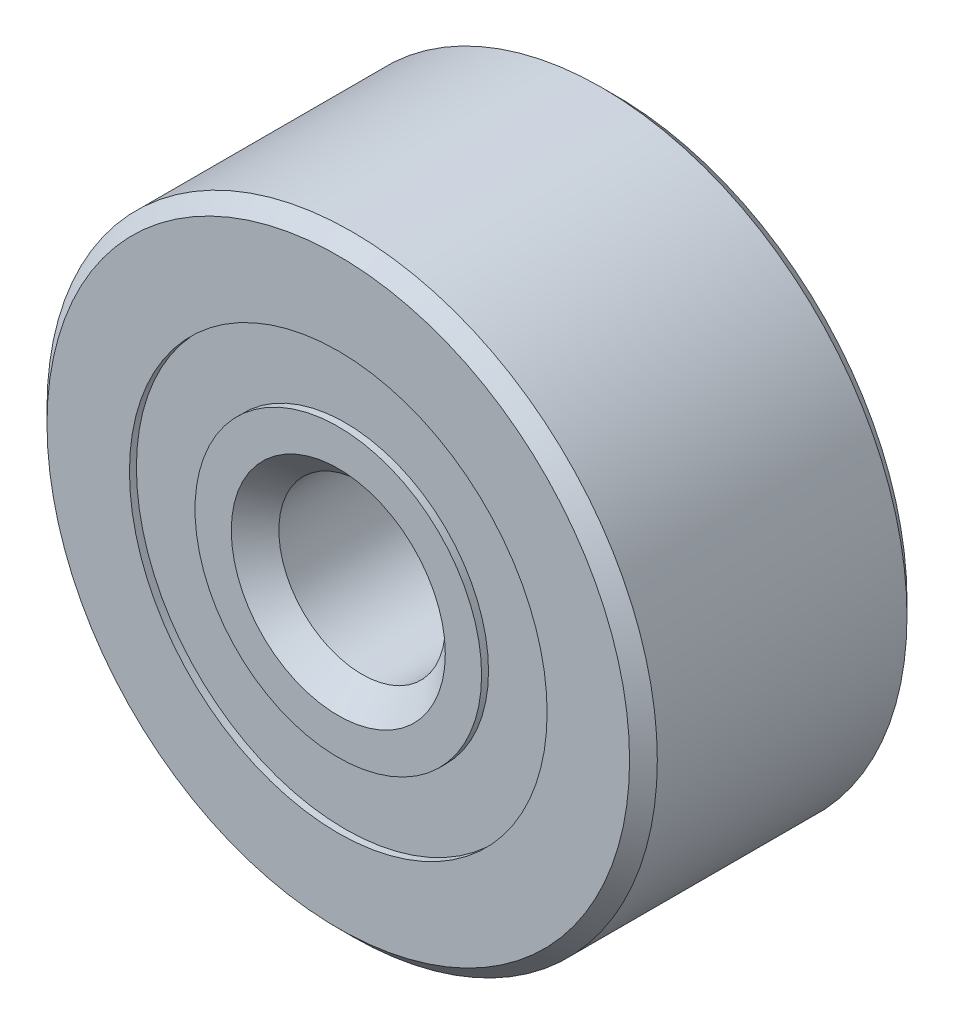
ISO-10303-21;
HEADER;
FILE_DESCRIPTION(('STEP AP214'),'2;1');
FILE_NAME('part.step','',(''),(''),'','','');
FILE_SCHEMA(('AUTOMOTIVE_DESIGN { 1 0 10303 214 1 1 1 1 }'));
ENDSEC;
DATA;
#1=APPLICATION_CONTEXT('core data for automotive mechanical design processes');
#2=APPLICATION_PROTOCOL_DEFINITION('international standard','automotive_design',2000,#1);
#3=PRODUCT_CONTEXT('',#1,'mechanical');
#4=PRODUCT('Part','Part','',(#3));
#5=PRODUCT_RELATED_PRODUCT_CATEGORY('part','',(#4));
#6=PRODUCT_DEFINITION_FORMATION('','',#4);
#7=PRODUCT_DEFINITION_CONTEXT('part definition',#1,'design');
#8=PRODUCT_DEFINITION('design','',#6,#7);
#9=PRODUCT_DEFINITION_SHAPE('','',#8);
#10=(LENGTH_UNIT() NAMED_UNIT(*) SI_UNIT(.MILLI.,.METRE.));
#11=(NAMED_UNIT(*) PLANE_ANGLE_UNIT() SI_UNIT($,.RADIAN.));
#12=(NAMED_UNIT(*) SI_UNIT($,.STERADIAN.) SOLID_ANGLE_UNIT());
#13=UNCERTAINTY_MEASURE_WITH_UNIT(LENGTH_MEASURE(1.E-05),#10,'distance_accuracy_value','');
#14=(GEOMETRIC_REPRESENTATION_CONTEXT(3) GLOBAL_UNCERTAINTY_ASSIGNED_CONTEXT((#13)) GLOBAL_UNIT_ASSIGNED_CONTEXT((#10,
#11,#12)) REPRESENTATION_CONTEXT('',''));
#15=CARTESIAN_POINT('',(0.,0.,0.));
#16=DIRECTION('',(0.,0.,1.));
#17=DIRECTION('',(1.,0.,0.));
#18=AXIS2_PLACEMENT_3D('',#15,#16,#17);
#19=CARTESIAN_POINT('',(0.,5.97493131868132,-3.7703125));
#20=DIRECTION('',(0.,0.,1.));
#21=DIRECTION('',(1.,0.,0.));
#22=AXIS2_PLACEMENT_3D('',#19,#20,#21);
#23=PLANE('',#22);
#24=CARTESIAN_POINT('',(0.,0.,-3.7703125));
#25=DIRECTION('',(0.,0.,1.));
#26=DIRECTION('',(1.,0.,0.));
#27=AXIS2_PLACEMENT_3D('',#24,#25,#26);
#28=CIRCLE('',#27,5.97493131868132);
#29=CARTESIAN_POINT('',(5.97493131868132,0.,-3.7703125));
#30=VERTEX_POINT('',#29);
#31=EDGE_CURVE('E55',#30,#30,#28,.T.);
#32=ORIENTED_EDGE('',*,*,#31,.F.);
#33=EDGE_LOOP('',(#32));
#34=FACE_BOUND('',#33,.T.);
#35=CARTESIAN_POINT('',(0.,0.,-3.7703125));
#36=DIRECTION('',(0.,0.,1.));
#37=DIRECTION('',(1.,0.,0.));
#38=AXIS2_PLACEMENT_3D('',#35,#36,#37);
#39=CIRCLE('',#38,4.09993491646653);
#40=CARTESIAN_POINT('',(4.09993491646653,0.,-3.7703125));
#41=VERTEX_POINT('',#40);
#42=EDGE_CURVE('E11',#41,#41,#39,.T.);
#43=ORIENTED_EDGE('',*,*,#42,.T.);
#44=EDGE_LOOP('',(#43));
#45=FACE_BOUND('',#44,.T.);
#46=ADVANCED_FACE('F41',(#34,#45),#23,.F.);
#47=CARTESIAN_POINT('',(0.,0.,3.96875));
#48=DIRECTION('',(0.,0.,1.));
#49=DIRECTION('',(1.,0.,0.));
#50=AXIS2_PLACEMENT_3D('',#47,#48,#49);
#51=CYLINDRICAL_SURFACE('',#50,4.09993491646653);
#52=ORIENTED_EDGE('',*,*,#42,.F.);
#53=EDGE_LOOP('',(#52));
#54=FACE_BOUND('',#53,.T.);
#55=CARTESIAN_POINT('',(0.,0.,-1.81289769677122));
#56=DIRECTION('',(0.,0.,1.));
#57=DIRECTION('',(1.,0.,0.));
#58=AXIS2_PLACEMENT_3D('',#55,#56,#57);
#59=CIRCLE('',#58,4.09993491646653);
#60=CARTESIAN_POINT('',(4.09993491646653,0.,-1.81289769677122));
#61=VERTEX_POINT('',#60);
#62=EDGE_CURVE('E47',#61,#61,#59,.T.);
#63=ORIENTED_EDGE('',*,*,#62,.T.);
#64=EDGE_LOOP('',(#63));
#65=FACE_BOUND('',#64,.T.);
#66=ADVANCED_FACE('F64',(#54,#65),#51,.F.);
#67=CARTESIAN_POINT('',(0.,5.97493131868132,-1.81289769677122));
#68=DIRECTION('',(0.,0.,-1.));
#69=DIRECTION('',(-1.,0.,0.));
#70=AXIS2_PLACEMENT_3D('',#67,#68,#69);
#71=PLANE('',#70);
#72=ORIENTED_EDGE('',*,*,#62,.F.);
#73=EDGE_LOOP('',(#72));
#74=FACE_BOUND('',#73,.T.);
#75=CARTESIAN_POINT('',(0.,0.,-1.81289769677122));
#76=DIRECTION('',(0.,0.,1.));
#77=DIRECTION('',(1.,0.,0.));
#78=AXIS2_PLACEMENT_3D('',#75,#76,#77);
#79=CIRCLE('',#78,5.97493131868132);
#80=CARTESIAN_POINT('',(5.97493131868132,0.,-1.81289769677122));
#81=VERTEX_POINT('',#80);
#82=EDGE_CURVE('E51',#81,#81,#79,.T.);
#83=ORIENTED_EDGE('',*,*,#82,.T.);
#84=EDGE_LOOP('',(#83));
#85=FACE_BOUND('',#84,.T.);
#86=ADVANCED_FACE('F68',(#74,#85),#71,.F.);
#87=CARTESIAN_POINT('',(0.,0.,3.96875));
#88=DIRECTION('',(0.,0.,1.));
#89=DIRECTION('',(1.,0.,0.));
#90=AXIS2_PLACEMENT_3D('',#87,#88,#89);
#91=CYLINDRICAL_SURFACE('',#90,5.97493131868132);
#92=ORIENTED_EDGE('',*,*,#82,.F.);
#93=EDGE_LOOP('',(#92));
#94=FACE_BOUND('',#93,.T.);
#95=ORIENTED_EDGE('',*,*,#31,.T.);
#96=EDGE_LOOP('',(#95));
#97=FACE_BOUND('',#96,.T.);
#98=ADVANCED_FACE('F61',(#94,#97),#91,.T.);
#99=CLOSED_SHELL('',(#46,#66,#86,#98));
#100=MANIFOLD_SOLID_BREP('B2',#99);
#101=CARTESIAN_POINT('',(0.,5.97493131868132,3.7703125));
#102=DIRECTION('',(0.,0.,-1.));
#103=DIRECTION('',(-1.,0.,0.));
#104=AXIS2_PLACEMENT_3D('',#101,#102,#103);
#105=PLANE('',#104);
#106=CARTESIAN_POINT('',(0.,0.,3.7703125));
#107=DIRECTION('',(0.,0.,1.));
#108=DIRECTION('',(1.,0.,0.));
#109=AXIS2_PLACEMENT_3D('',#106,#107,#108);
#110=CIRCLE('',#109,4.09993491646653);
#111=CARTESIAN_POINT('',(4.09993491646653,0.,3.7703125));
#112=VERTEX_POINT('',#111);
#113=EDGE_CURVE('E40',#112,#112,#110,.T.);
#114=ORIENTED_EDGE('',*,*,#113,.F.);
#115=EDGE_LOOP('',(#114));
#116=FACE_BOUND('',#115,.T.);
#117=CARTESIAN_POINT('',(0.,0.,3.7703125));
#118=DIRECTION('',(0.,0.,1.));
#119=DIRECTION('',(1.,0.,0.));
#120=AXIS2_PLACEMENT_3D('',#117,#118,#119);
#121=CIRCLE('',#120,5.97493131868132);
#122=CARTESIAN_POINT('',(5.97493131868132,0.,3.7703125));
#123=VERTEX_POINT('',#122);
#124=EDGE_CURVE('E122',#123,#123,#121,.T.);
#125=ORIENTED_EDGE('',*,*,#124,.T.);
#126=EDGE_LOOP('',(#125));
#127=FACE_BOUND('',#126,.T.);
#128=ADVANCED_FACE('F108',(#116,#127),#105,.F.);
#129=CARTESIAN_POINT('',(0.,0.,3.96875));
#130=DIRECTION('',(0.,0.,1.));
#131=DIRECTION('',(1.,0.,0.));
#132=AXIS2_PLACEMENT_3D('',#129,#130,#131);
#133=CYLINDRICAL_SURFACE('',#132,4.09993491646653);
#134=CARTESIAN_POINT('',(0.,0.,1.81289769677122));
#135=DIRECTION('',(0.,0.,1.));
#136=DIRECTION('',(1.,0.,0.));
#137=AXIS2_PLACEMENT_3D('',#134,#135,#136);
#138=CIRCLE('',#137,4.09993491646653);
#139=CARTESIAN_POINT('',(4.09993491646653,0.,1.81289769677122));
#140=VERTEX_POINT('',#139);
#141=EDGE_CURVE('E114',#140,#140,#138,.T.);
#142=ORIENTED_EDGE('',*,*,#141,.F.);
#143=EDGE_LOOP('',(#142));
#144=FACE_BOUND('',#143,.T.);
#145=ORIENTED_EDGE('',*,*,#113,.T.);
#146=EDGE_LOOP('',(#145));
#147=FACE_BOUND('',#146,.T.);
#148=ADVANCED_FACE('F137',(#144,#147),#133,.F.);
#149=CARTESIAN_POINT('',(0.,5.97493131868132,1.81289769677122));
#150=DIRECTION('',(0.,0.,1.));
#151=DIRECTION('',(1.,0.,0.));
#152=AXIS2_PLACEMENT_3D('',#149,#150,#151);
#153=PLANE('',#152);
#154=CARTESIAN_POINT('',(0.,0.,1.81289769677122));
#155=DIRECTION('',(0.,0.,1.));
#156=DIRECTION('',(1.,0.,0.));
#157=AXIS2_PLACEMENT_3D('',#154,#155,#156);
#158=CIRCLE('',#157,5.97493131868132);
#159=CARTESIAN_POINT('',(5.97493131868132,0.,1.81289769677122));
#160=VERTEX_POINT('',#159);
#161=EDGE_CURVE('E118',#160,#160,#158,.T.);
#162=ORIENTED_EDGE('',*,*,#161,.F.);
#163=EDGE_LOOP('',(#162));
#164=FACE_BOUND('',#163,.T.);
#165=ORIENTED_EDGE('',*,*,#141,.T.);
#166=EDGE_LOOP('',(#165));
#167=FACE_BOUND('',#166,.T.);
#168=ADVANCED_FACE('F132',(#164,#167),#153,.F.);
#169=CARTESIAN_POINT('',(0.,0.,3.96875));
#170=DIRECTION('',(0.,0.,1.));
#171=DIRECTION('',(1.,0.,0.));
#172=AXIS2_PLACEMENT_3D('',#169,#170,#171);
#173=CYLINDRICAL_SURFACE('',#172,5.97493131868132);
#174=ORIENTED_EDGE('',*,*,#124,.F.);
#175=EDGE_LOOP('',(#174));
#176=FACE_BOUND('',#175,.T.);
#177=ORIENTED_EDGE('',*,*,#161,.T.);
#178=EDGE_LOOP('',(#177));
#179=FACE_BOUND('',#178,.T.);
#180=ADVANCED_FACE('F129',(#176,#179),#173,.T.);
#181=CLOSED_SHELL('',(#128,#148,#168,#180));
#182=MANIFOLD_SOLID_BREP('B6',#181);
#183=CARTESIAN_POINT('',(-3.92886205296771,3.9288620529678,0.));
#184=DIRECTION('',(0.,0.,1.));
#185=DIRECTION('',(-0.707106781186539,0.707106781186556,0.));
#186=AXIS2_PLACEMENT_3D('',#183,#184,#185);
#187=SPHERICAL_SURFACE('',#186,1.81289769677122);
#188=CARTESIAN_POINT('',(-3.92886205296771,3.9288620529678,1.81289769677122));
#189=VERTEX_POINT('',#188);
#190=VERTEX_LOOP('',#189);
#191=FACE_BOUND('',#190,.T.);
#192=ADVANCED_FACE('F188',(#191),#187,.T.);
#193=CLOSED_SHELL('',(#192));
#194=MANIFOLD_SOLID_BREP('B35',#193);
#195=CARTESIAN_POINT('',(-5.55625,0.,0.));
#196=DIRECTION('',(0.,0.,1.));
#197=DIRECTION('',(-1.,0.,0.));
#198=AXIS2_PLACEMENT_3D('',#195,#196,#197);
#199=SPHERICAL_SURFACE('',#198,1.81289769677122);
#200=CARTESIAN_POINT('',(-5.55625,0.,1.81289769677122));
#201=VERTEX_POINT('',#200);
#202=VERTEX_LOOP('',#201);
#203=FACE_BOUND('',#202,.T.);
#204=ADVANCED_FACE('F219',(#203),#199,.T.);
#205=CLOSED_SHELL('',(#204));
#206=MANIFOLD_SOLID_BREP('B104',#205);
#207=CARTESIAN_POINT('',(-3.92886205296779,-3.92886205296772,0.));
#208=DIRECTION('',(0.,0.,1.));
#209=DIRECTION('',(-0.707106781186554,-0.707106781186541,0.));
#210=AXIS2_PLACEMENT_3D('',#207,#208,#209);
#211=SPHERICAL_SURFACE('',#210,1.81289769677122);
#212=CARTESIAN_POINT('',(-3.92886205296779,-3.92886205296772,1.81289769677122));
#213=VERTEX_POINT('',#212);
#214=VERTEX_LOOP('',#213);
#215=FACE_BOUND('',#214,.T.);
#216=ADVANCED_FACE('F250',(#215),#211,.T.);
#217=CLOSED_SHELL('',(#216));
#218=MANIFOLD_SOLID_BREP('B184',#217);
#219=CARTESIAN_POINT('',(0.,-5.55625,0.));
#220=DIRECTION('',(0.,0.,1.));
#221=DIRECTION('',(0.,-1.,0.));
#222=AXIS2_PLACEMENT_3D('',#219,#220,#221);
#223=SPHERICAL_SURFACE('',#222,1.81289769677122);
#224=CARTESIAN_POINT('',(0.,-5.55625,1.81289769677122));
#225=VERTEX_POINT('',#224);
#226=VERTEX_LOOP('',#225);
#227=FACE_BOUND('',#226,.T.);
#228=ADVANCED_FACE('F281',(#227),#223,.T.);
#229=CLOSED_SHELL('',(#228));
#230=MANIFOLD_SOLID_BREP('B215',#229);
#231=CARTESIAN_POINT('',(3.92886205296773,-3.92886205296778,0.));
#232=DIRECTION('',(0.,0.,1.));
#233=DIRECTION('',(0.707106781186544,-0.707106781186551,0.));
#234=AXIS2_PLACEMENT_3D('',#231,#232,#233);
#235=SPHERICAL_SURFACE('',#234,1.81289769677122);
#236=CARTESIAN_POINT('',(3.92886205296773,-3.92886205296778,1.81289769677122));
#237=VERTEX_POINT('',#236);
#238=VERTEX_LOOP('',#237);
#239=FACE_BOUND('',#238,.T.);
#240=ADVANCED_FACE('F312',(#239),#235,.T.);
#241=CLOSED_SHELL('',(#240));
#242=MANIFOLD_SOLID_BREP('B246',#241);
#243=CARTESIAN_POINT('',(5.55625,0.,0.));
#244=DIRECTION('',(0.,0.,1.));
#245=DIRECTION('',(1.,0.,0.));
#246=AXIS2_PLACEMENT_3D('',#243,#244,#245);
#247=SPHERICAL_SURFACE('',#246,1.81289769677122);
#248=CARTESIAN_POINT('',(5.55625,0.,1.81289769677122));
#249=VERTEX_POINT('',#248);
#250=VERTEX_LOOP('',#249);
#251=FACE_BOUND('',#250,.T.);
#252=ADVANCED_FACE('F343',(#251),#247,.T.);
#253=CLOSED_SHELL('',(#252));
#254=MANIFOLD_SOLID_BREP('B277',#253);
#255=CARTESIAN_POINT('',(3.92886205296776,3.92886205296775,0.));
#256=DIRECTION('',(0.,0.,1.));
#257=DIRECTION('',(0.707106781186549,0.707106781186546,0.));
#258=AXIS2_PLACEMENT_3D('',#255,#256,#257);
#259=SPHERICAL_SURFACE('',#258,1.81289769677122);
#260=CARTESIAN_POINT('',(3.92886205296776,3.92886205296775,1.81289769677122));
#261=VERTEX_POINT('',#260);
#262=VERTEX_LOOP('',#261);
#263=FACE_BOUND('',#262,.T.);
#264=ADVANCED_FACE('F374',(#263),#259,.T.);
#265=CLOSED_SHELL('',(#264));
#266=MANIFOLD_SOLID_BREP('B308',#265);
#267=CARTESIAN_POINT('',(0.,5.55625,0.));
#268=DIRECTION('',(0.,0.,1.));
#269=DIRECTION('',(0.,1.,0.));
#270=AXIS2_PLACEMENT_3D('',#267,#268,#269);
#271=SPHERICAL_SURFACE('',#270,1.81289769677122);
#272=CARTESIAN_POINT('',(0.,5.55625,1.81289769677122));
#273=VERTEX_POINT('',#272);
#274=VERTEX_LOOP('',#273);
#275=FACE_BOUND('',#274,.T.);
#276=ADVANCED_FACE('F407',(#275),#271,.T.);
#277=CLOSED_SHELL('',(#276));
#278=MANIFOLD_SOLID_BREP('B339',#277);
#279=CARTESIAN_POINT('',(0.,0.,3.96875));
#280=DIRECTION('',(0.,0.,1.));
#281=DIRECTION('',(1.,0.,0.));
#282=AXIS2_PLACEMENT_3D('',#279,#280,#281);
#283=CYLINDRICAL_SURFACE('',#282,4.09993491646653);
#284=CARTESIAN_POINT('',(0.,0.,3.96875));
#285=DIRECTION('',(0.,0.,1.));
#286=DIRECTION('',(1.,0.,0.));
#287=AXIS2_PLACEMENT_3D('',#284,#285,#286);
#288=CIRCLE('',#287,4.09993491646653);
#289=CARTESIAN_POINT('',(4.09993491646653,0.,3.96875));
#290=VERTEX_POINT('',#289);
#291=EDGE_CURVE('E466',#290,#290,#288,.T.);
#292=ORIENTED_EDGE('',*,*,#291,.F.);
#293=EDGE_LOOP('',(#292));
#294=FACE_BOUND('',#293,.T.);
#295=CARTESIAN_POINT('',(0.,0.,3.7703125));
#296=DIRECTION('',(0.,0.,1.));
#297=DIRECTION('',(1.,0.,0.));
#298=AXIS2_PLACEMENT_3D('',#295,#296,#297);
#299=CIRCLE('',#298,4.09993491646653);
#300=CARTESIAN_POINT('',(4.09993491646653,0.,3.7703125));
#301=VERTEX_POINT('',#300);
#302=EDGE_CURVE('E406',#301,#301,#299,.T.);
#303=ORIENTED_EDGE('',*,*,#302,.T.);
#304=EDGE_LOOP('',(#303));
#305=FACE_BOUND('',#304,.T.);
#306=ADVANCED_FACE('F426',(#294,#305),#283,.T.);
#307=CARTESIAN_POINT('',(0.,4.09993491646653,3.7703125));
#308=DIRECTION('',(0.,0.,1.));
#309=DIRECTION('',(1.,0.,0.));
#310=AXIS2_PLACEMENT_3D('',#307,#308,#309);
#311=PLANE('',#310);
#312=ORIENTED_EDGE('',*,*,#302,.F.);
#313=EDGE_LOOP('',(#312));
#314=FACE_BOUND('',#313,.T.);
#315=CARTESIAN_POINT('',(0.,0.,3.7703125));
#316=DIRECTION('',(0.,0.,1.));
#317=DIRECTION('',(1.,0.,0.));
#318=AXIS2_PLACEMENT_3D('',#315,#316,#317);
#319=CIRCLE('',#318,3.90149741646653);
#320=CARTESIAN_POINT('',(3.90149741646653,0.,3.7703125));
#321=VERTEX_POINT('',#320);
#322=EDGE_CURVE('E432',#321,#321,#319,.T.);
#323=ORIENTED_EDGE('',*,*,#322,.T.);
#324=EDGE_LOOP('',(#323));
#325=FACE_BOUND('',#324,.T.);
#326=ADVANCED_FACE('F473',(#314,#325),#311,.F.);
#327=CARTESIAN_POINT('',(0.,0.,2.93111623514786));
#328=DIRECTION('',(0.,0.,1.));
#329=DIRECTION('',(1.,0.,0.));
#330=AXIS2_PLACEMENT_3D('',#327,#328,#329);
#331=CONICAL_SURFACE('',#330,3.06230115161439,0.78539816339745);
#332=ORIENTED_EDGE('',*,*,#322,.F.);
#333=EDGE_LOOP('',(#332));
#334=FACE_BOUND('',#333,.T.);
#335=CARTESIAN_POINT('',(0.,0.,2.93111623514786));
#336=DIRECTION('',(0.,0.,1.));
#337=DIRECTION('',(1.,0.,0.));
#338=AXIS2_PLACEMENT_3D('',#335,#336,#337);
#339=CIRCLE('',#338,3.06230115161439);
#340=CARTESIAN_POINT('',(3.06230115161439,0.,2.93111623514786));
#341=VERTEX_POINT('',#340);
#342=EDGE_CURVE('E436',#341,#341,#339,.T.);
#343=ORIENTED_EDGE('',*,*,#342,.T.);
#344=EDGE_LOOP('',(#343));
#345=FACE_BOUND('',#344,.T.);
#346=ADVANCED_FACE('F477',(#334,#345),#331,.T.);
#347=CARTESIAN_POINT('',(0.,0.,3.96875));
#348=DIRECTION('',(0.,0.,1.));
#349=DIRECTION('',(1.,0.,0.));
#350=AXIS2_PLACEMENT_3D('',#347,#348,#349);
#351=CYLINDRICAL_SURFACE('',#350,3.06230115161439);
#352=ORIENTED_EDGE('',*,*,#342,.F.);
#353=EDGE_LOOP('',(#352));
#354=FACE_BOUND('',#353,.T.);
#355=CARTESIAN_POINT('',(0.,0.,0.));
#356=DIRECTION('',(0.,0.,1.));
#357=DIRECTION('',(1.,0.,0.));
#358=AXIS2_PLACEMENT_3D('',#355,#356,#357);
#359=CIRCLE('',#358,3.06230115161439);
#360=CARTESIAN_POINT('',(3.06230115161439,0.,0.));
#361=VERTEX_POINT('',#360);
#362=EDGE_CURVE('E440',#361,#361,#359,.T.);
#363=ORIENTED_EDGE('',*,*,#362,.T.);
#364=EDGE_LOOP('',(#363));
#365=FACE_BOUND('',#364,.T.);
#366=ADVANCED_FACE('F482',(#354,#365),#351,.T.);
#367=CARTESIAN_POINT('',(0.,3.06230115161439,0.));
#368=DIRECTION('',(0.,0.,-1.));
#369=DIRECTION('',(-1.,0.,0.));
#370=AXIS2_PLACEMENT_3D('',#367,#368,#369);
#371=PLANE('',#370);
#372=ORIENTED_EDGE('',*,*,#362,.F.);
#373=EDGE_LOOP('',(#372));
#374=FACE_BOUND('',#373,.T.);
#375=CARTESIAN_POINT('',(0.,0.,0.));
#376=DIRECTION('',(0.,0.,1.));
#377=DIRECTION('',(1.,0.,0.));
#378=AXIS2_PLACEMENT_3D('',#375,#376,#377);
#379=CIRCLE('',#378,3.74335230322878);
#380=CARTESIAN_POINT('',(3.74335230322878,0.,0.));
#381=VERTEX_POINT('',#380);
#382=EDGE_CURVE('E445',#381,#381,#379,.T.);
#383=ORIENTED_EDGE('',*,*,#382,.T.);
#384=EDGE_LOOP('',(#383));
#385=FACE_BOUND('',#384,.T.);
#386=ADVANCED_FACE('F488',(#374,#385),#371,.F.);
#387=CARTESIAN_POINT('',(0.,0.,0.));
#388=DIRECTION('',(0.,0.,1.));
#389=DIRECTION('',(1.,0.,0.));
#390=AXIS2_PLACEMENT_3D('',#387,#388,#389);
#391=TOROIDAL_SURFACE('',#390,5.55625,1.81289769677122);
#392=ORIENTED_EDGE('',*,*,#382,.F.);
#393=EDGE_LOOP('',(#392));
#394=FACE_BOUND('',#393,.T.);
#395=CARTESIAN_POINT('',(0.,0.,-1.76388888888889));
#396=DIRECTION('',(0.,0.,1.));
#397=DIRECTION('',(1.,0.,0.));
#398=AXIS2_PLACEMENT_3D('',#395,#396,#397);
#399=CIRCLE('',#398,5.13756868131868);
#400=CARTESIAN_POINT('',(5.13756868131868,0.,-1.76388888888889));
#401=VERTEX_POINT('',#400);
#402=EDGE_CURVE('E448',#401,#401,#399,.T.);
#403=ORIENTED_EDGE('',*,*,#402,.T.);
#404=EDGE_LOOP('',(#403));
#405=FACE_BOUND('',#404,.T.);
#406=ADVANCED_FACE('F492',(#394,#405),#391,.F.);
#407=CARTESIAN_POINT('',(0.,0.,3.96875));
#408=DIRECTION('',(0.,0.,1.));
#409=DIRECTION('',(1.,0.,0.));
#410=AXIS2_PLACEMENT_3D('',#407,#408,#409);
#411=CYLINDRICAL_SURFACE('',#410,5.13756868131868);
#412=ORIENTED_EDGE('',*,*,#402,.F.);
#413=EDGE_LOOP('',(#412));
#414=FACE_BOUND('',#413,.T.);
#415=CARTESIAN_POINT('',(0.,0.,-3.96875));
#416=DIRECTION('',(0.,0.,1.));
#417=DIRECTION('',(1.,0.,0.));
#418=AXIS2_PLACEMENT_3D('',#415,#416,#417);
#419=CIRCLE('',#418,5.13756868131868);
#420=CARTESIAN_POINT('',(5.13756868131868,0.,-3.96875));
#421=VERTEX_POINT('',#420);
#422=EDGE_CURVE('E451',#421,#421,#419,.T.);
#423=ORIENTED_EDGE('',*,*,#422,.T.);
#424=EDGE_LOOP('',(#423));
#425=FACE_BOUND('',#424,.T.);
#426=ADVANCED_FACE('F496',(#414,#425),#411,.T.);
#427=CARTESIAN_POINT('',(0.,2.778125,-3.96875));
#428=DIRECTION('',(0.,0.,1.));
#429=DIRECTION('',(1.,0.,0.));
#430=AXIS2_PLACEMENT_3D('',#427,#428,#429);
#431=PLANE('',#430);
#432=ORIENTED_EDGE('',*,*,#422,.F.);
#433=EDGE_LOOP('',(#432));
#434=FACE_BOUND('',#433,.T.);
#435=CARTESIAN_POINT('',(0.,0.,-3.96875));
#436=DIRECTION('',(0.,0.,1.));
#437=DIRECTION('',(1.,0.,0.));
#438=AXIS2_PLACEMENT_3D('',#435,#436,#437);
#439=CIRCLE('',#438,2.778125);
#440=CARTESIAN_POINT('',(2.778125,0.,-3.96875));
#441=VERTEX_POINT('',#440);
#442=EDGE_CURVE('E454',#441,#441,#439,.T.);
#443=ORIENTED_EDGE('',*,*,#442,.T.);
#444=EDGE_LOOP('',(#443));
#445=FACE_BOUND('',#444,.T.);
#446=ADVANCED_FACE('F500',(#434,#445),#431,.F.);
#447=CARTESIAN_POINT('',(0.,0.,-3.571875));
#448=DIRECTION('',(0.,0.,-1.));
#449=DIRECTION('',(-1.,0.,0.));
#450=AXIS2_PLACEMENT_3D('',#447,#448,#449);
#451=CONICAL_SURFACE('',#450,2.38125,0.785398163397446);
#452=ORIENTED_EDGE('',*,*,#442,.F.);
#453=EDGE_LOOP('',(#452));
#454=FACE_BOUND('',#453,.T.);
#455=CARTESIAN_POINT('',(0.,0.,-3.571875));
#456=DIRECTION('',(0.,0.,1.));
#457=DIRECTION('',(1.,0.,0.));
#458=AXIS2_PLACEMENT_3D('',#455,#456,#457);
#459=CIRCLE('',#458,2.38125);
#460=CARTESIAN_POINT('',(2.38125,0.,-3.571875));
#461=VERTEX_POINT('',#460);
#462=EDGE_CURVE('E457',#461,#461,#459,.T.);
#463=ORIENTED_EDGE('',*,*,#462,.T.);
#464=EDGE_LOOP('',(#463));
#465=FACE_BOUND('',#464,.T.);
#466=ADVANCED_FACE('F504',(#454,#465),#451,.F.);
#467=CARTESIAN_POINT('',(0.,0.,3.96875));
#468=DIRECTION('',(0.,0.,1.));
#469=DIRECTION('',(1.,0.,0.));
#470=AXIS2_PLACEMENT_3D('',#467,#468,#469);
#471=CYLINDRICAL_SURFACE('',#470,2.38125);
#472=ORIENTED_EDGE('',*,*,#462,.F.);
#473=EDGE_LOOP('',(#472));
#474=FACE_BOUND('',#473,.T.);
#475=CARTESIAN_POINT('',(0.,0.,3.28769884838562));
#476=DIRECTION('',(0.,0.,1.));
#477=DIRECTION('',(1.,0.,0.));
#478=AXIS2_PLACEMENT_3D('',#475,#476,#477);
#479=CIRCLE('',#478,2.38125);
#480=CARTESIAN_POINT('',(2.38125,0.,3.28769884838562));
#481=VERTEX_POINT('',#480);
#482=EDGE_CURVE('E460',#481,#481,#479,.T.);
#483=ORIENTED_EDGE('',*,*,#482,.T.);
#484=EDGE_LOOP('',(#483));
#485=FACE_BOUND('',#484,.T.);
#486=ADVANCED_FACE('F508',(#474,#485),#471,.F.);
#487=CARTESIAN_POINT('',(0.,0.,3.96875));
#488=DIRECTION('',(0.,0.,1.));
#489=DIRECTION('',(1.,0.,0.));
#490=AXIS2_PLACEMENT_3D('',#487,#488,#489);
#491=CONICAL_SURFACE('',#490,3.06230115161439,0.78539816339745);
#492=ORIENTED_EDGE('',*,*,#482,.F.);
#493=EDGE_LOOP('',(#492));
#494=FACE_BOUND('',#493,.T.);
#495=CARTESIAN_POINT('',(0.,0.,3.96875));
#496=DIRECTION('',(0.,0.,1.));
#497=DIRECTION('',(1.,0.,0.));
#498=AXIS2_PLACEMENT_3D('',#495,#496,#497);
#499=CIRCLE('',#498,3.06230115161439);
#500=CARTESIAN_POINT('',(3.06230115161439,0.,3.96875));
#501=VERTEX_POINT('',#500);
#502=EDGE_CURVE('E463',#501,#501,#499,.T.);
#503=ORIENTED_EDGE('',*,*,#502,.T.);
#504=EDGE_LOOP('',(#503));
#505=FACE_BOUND('',#504,.T.);
#506=ADVANCED_FACE('F512',(#494,#505),#491,.F.);
#507=CARTESIAN_POINT('',(0.,4.09993491646653,3.96875));
#508=DIRECTION('',(0.,0.,-1.));
#509=DIRECTION('',(-1.,0.,0.));
#510=AXIS2_PLACEMENT_3D('',#507,#508,#509);
#511=PLANE('',#510);
#512=ORIENTED_EDGE('',*,*,#502,.F.);
#513=EDGE_LOOP('',(#512));
#514=FACE_BOUND('',#513,.T.);
#515=ORIENTED_EDGE('',*,*,#291,.T.);
#516=EDGE_LOOP('',(#515));
#517=FACE_BOUND('',#516,.T.);
#518=ADVANCED_FACE('F470',(#514,#517),#511,.F.);
#519=CLOSED_SHELL('',(#306,#326,#346,#366,#386,#406,#426,#446,#466,#486,#506,#518));
#520=MANIFOLD_SOLID_BREP('B370',#519);
#521=CARTESIAN_POINT('',(0.,0.,3.571875));
#522=DIRECTION('',(0.,0.,-1.));
#523=DIRECTION('',(-1.,0.,0.));
#524=AXIS2_PLACEMENT_3D('',#521,#522,#523);
#525=CONICAL_SURFACE('',#524,8.73125,0.785398163397447);
#526=CARTESIAN_POINT('',(0.,0.,3.96875));
#527=DIRECTION('',(0.,0.,1.));
#528=DIRECTION('',(1.,0.,0.));
#529=AXIS2_PLACEMENT_3D('',#526,#527,#528);
#530=CIRCLE('',#529,8.334375);
#531=CARTESIAN_POINT('',(8.334375,0.,3.96875));
#532=VERTEX_POINT('',#531);
#533=EDGE_CURVE('E635',#532,#532,#530,.T.);
#534=ORIENTED_EDGE('',*,*,#533,.F.);
#535=EDGE_LOOP('',(#534));
#536=FACE_BOUND('',#535,.T.);
#537=CARTESIAN_POINT('',(0.,0.,3.571875));
#538=DIRECTION('',(0.,0.,1.));
#539=DIRECTION('',(1.,0.,0.));
#540=AXIS2_PLACEMENT_3D('',#537,#538,#539);
#541=CIRCLE('',#540,8.73125);
#542=CARTESIAN_POINT('',(8.73125,0.,3.571875));
#543=VERTEX_POINT('',#542);
#544=EDGE_CURVE('E425',#543,#543,#541,.T.);
#545=ORIENTED_EDGE('',*,*,#544,.T.);
#546=EDGE_LOOP('',(#545));
#547=FACE_BOUND('',#546,.T.);
#548=ADVANCED_FACE('F607',(#536,#547),#525,.T.);
#549=CARTESIAN_POINT('',(0.,0.,3.96875));
#550=DIRECTION('',(0.,0.,1.));
#551=DIRECTION('',(1.,0.,0.));
#552=AXIS2_PLACEMENT_3D('',#549,#550,#551);
#553=CYLINDRICAL_SURFACE('',#552,8.73125);
#554=ORIENTED_EDGE('',*,*,#544,.F.);
#555=EDGE_LOOP('',(#554));
#556=FACE_BOUND('',#555,.T.);
#557=CARTESIAN_POINT('',(0.,0.,-3.571875));
#558=DIRECTION('',(0.,0.,1.));
#559=DIRECTION('',(1.,0.,0.));
#560=AXIS2_PLACEMENT_3D('',#557,#558,#559);
#561=CIRCLE('',#560,8.73125);
#562=CARTESIAN_POINT('',(8.73125,0.,-3.571875));
#563=VERTEX_POINT('',#562);
#564=EDGE_CURVE('E613',#563,#563,#561,.T.);
#565=ORIENTED_EDGE('',*,*,#564,.T.);
#566=EDGE_LOOP('',(#565));
#567=FACE_BOUND('',#566,.T.);
#568=ADVANCED_FACE('F642',(#556,#567),#553,.T.);
#569=CARTESIAN_POINT('',(0.,0.,-3.96875));
#570=DIRECTION('',(0.,0.,1.));
#571=DIRECTION('',(1.,0.,0.));
#572=AXIS2_PLACEMENT_3D('',#569,#570,#571);
#573=CONICAL_SURFACE('',#572,8.334375,0.785398163397448);
#574=ORIENTED_EDGE('',*,*,#564,.F.);
#575=EDGE_LOOP('',(#574));
#576=FACE_BOUND('',#575,.T.);
#577=CARTESIAN_POINT('',(0.,0.,-3.96875));
#578=DIRECTION('',(0.,0.,1.));
#579=DIRECTION('',(1.,0.,0.));
#580=AXIS2_PLACEMENT_3D('',#577,#578,#579);
#581=CIRCLE('',#580,8.334375);
#582=CARTESIAN_POINT('',(8.334375,0.,-3.96875));
#583=VERTEX_POINT('',#582);
#584=EDGE_CURVE('E617',#583,#583,#581,.T.);
#585=ORIENTED_EDGE('',*,*,#584,.T.);
#586=EDGE_LOOP('',(#585));
#587=FACE_BOUND('',#586,.T.);
#588=ADVANCED_FACE('F646',(#576,#587),#573,.T.);
#589=CARTESIAN_POINT('',(0.,8.334375,-3.96875));
#590=DIRECTION('',(0.,0.,1.));
#591=DIRECTION('',(1.,0.,0.));
#592=AXIS2_PLACEMENT_3D('',#589,#590,#591);
#593=PLANE('',#592);
#594=ORIENTED_EDGE('',*,*,#584,.F.);
#595=EDGE_LOOP('',(#594));
#596=FACE_BOUND('',#595,.T.);
#597=CARTESIAN_POINT('',(0.,0.,-3.96875));
#598=DIRECTION('',(0.,0.,1.));
#599=DIRECTION('',(1.,0.,0.));
#600=AXIS2_PLACEMENT_3D('',#597,#598,#599);
#601=CIRCLE('',#600,5.97493131868132);
#602=CARTESIAN_POINT('',(5.97493131868132,0.,-3.96875));
#603=VERTEX_POINT('',#602);
#604=EDGE_CURVE('E621',#603,#603,#601,.T.);
#605=ORIENTED_EDGE('',*,*,#604,.T.);
#606=EDGE_LOOP('',(#605));
#607=FACE_BOUND('',#606,.T.);
#608=ADVANCED_FACE('F651',(#596,#607),#593,.F.);
#609=CARTESIAN_POINT('',(0.,0.,3.96875));
#610=DIRECTION('',(0.,0.,1.));
#611=DIRECTION('',(1.,0.,0.));
#612=AXIS2_PLACEMENT_3D('',#609,#610,#611);
#613=CYLINDRICAL_SURFACE('',#612,5.97493131868132);
#614=ORIENTED_EDGE('',*,*,#604,.F.);
#615=EDGE_LOOP('',(#614));
#616=FACE_BOUND('',#615,.T.);
#617=CARTESIAN_POINT('',(0.,0.,-1.76388888888889));
#618=DIRECTION('',(0.,0.,1.));
#619=DIRECTION('',(1.,0.,0.));
#620=AXIS2_PLACEMENT_3D('',#617,#618,#619);
#621=CIRCLE('',#620,5.97493131868132);
#622=CARTESIAN_POINT('',(5.97493131868132,0.,-1.76388888888889));
#623=VERTEX_POINT('',#622);
#624=EDGE_CURVE('E626',#623,#623,#621,.T.);
#625=ORIENTED_EDGE('',*,*,#624,.T.);
#626=EDGE_LOOP('',(#625));
#627=FACE_BOUND('',#626,.T.);
#628=ADVANCED_FACE('F657',(#616,#627),#613,.F.);
#629=CARTESIAN_POINT('',(0.,0.,0.));
#630=DIRECTION('',(0.,0.,1.));
#631=DIRECTION('',(1.,0.,0.));
#632=AXIS2_PLACEMENT_3D('',#629,#630,#631);
#633=TOROIDAL_SURFACE('',#632,5.55625,1.81289769677122);
#634=ORIENTED_EDGE('',*,*,#624,.F.);
#635=EDGE_LOOP('',(#634));
#636=FACE_BOUND('',#635,.T.);
#637=CARTESIAN_POINT('',(0.,0.,1.76388888888889));
#638=DIRECTION('',(0.,0.,1.));
#639=DIRECTION('',(1.,0.,0.));
#640=AXIS2_PLACEMENT_3D('',#637,#638,#639);
#641=CIRCLE('',#640,5.97493131868132);
#642=CARTESIAN_POINT('',(5.97493131868132,0.,1.76388888888889));
#643=VERTEX_POINT('',#642);
#644=EDGE_CURVE('E629',#643,#643,#641,.T.);
#645=ORIENTED_EDGE('',*,*,#644,.T.);
#646=EDGE_LOOP('',(#645));
#647=FACE_BOUND('',#646,.T.);
#648=ADVANCED_FACE('F661',(#636,#647),#633,.F.);
#649=CARTESIAN_POINT('',(0.,0.,3.96875));
#650=DIRECTION('',(0.,0.,1.));
#651=DIRECTION('',(1.,0.,0.));
#652=AXIS2_PLACEMENT_3D('',#649,#650,#651);
#653=CYLINDRICAL_SURFACE('',#652,5.97493131868132);
#654=ORIENTED_EDGE('',*,*,#644,.F.);
#655=EDGE_LOOP('',(#654));
#656=FACE_BOUND('',#655,.T.);
#657=CARTESIAN_POINT('',(0.,0.,3.96875));
#658=DIRECTION('',(0.,0.,1.));
#659=DIRECTION('',(1.,0.,0.));
#660=AXIS2_PLACEMENT_3D('',#657,#658,#659);
#661=CIRCLE('',#660,5.97493131868132);
#662=CARTESIAN_POINT('',(5.97493131868132,0.,3.96875));
#663=VERTEX_POINT('',#662);
#664=EDGE_CURVE('E632',#663,#663,#661,.T.);
#665=ORIENTED_EDGE('',*,*,#664,.T.);
#666=EDGE_LOOP('',(#665));
#667=FACE_BOUND('',#666,.T.);
#668=ADVANCED_FACE('F665',(#656,#667),#653,.F.);
#669=CARTESIAN_POINT('',(0.,8.334375,3.96875));
#670=DIRECTION('',(0.,0.,-1.));
#671=DIRECTION('',(-1.,0.,0.));
#672=AXIS2_PLACEMENT_3D('',#669,#670,#671);
#673=PLANE('',#672);
#674=ORIENTED_EDGE('',*,*,#664,.F.);
#675=EDGE_LOOP('',(#674));
#676=FACE_BOUND('',#675,.T.);
#677=ORIENTED_EDGE('',*,*,#533,.T.);
#678=EDGE_LOOP('',(#677));
#679=FACE_BOUND('',#678,.T.);
#680=ADVANCED_FACE('F639',(#676,#679),#673,.F.);
#681=CLOSED_SHELL('',(#548,#568,#588,#608,#628,#648,#668,#680));
#682=MANIFOLD_SOLID_BREP('B401',#681);
#683=ADVANCED_BREP_SHAPE_REPRESENTATION('',(#18,#100,#182,#194,#206,#218,#230,#242,#254,#266,
#278,#520,#682),#14);
#684=SHAPE_DEFINITION_REPRESENTATION(#9,#683);
ENDSEC;
END-ISO-10303-21;
